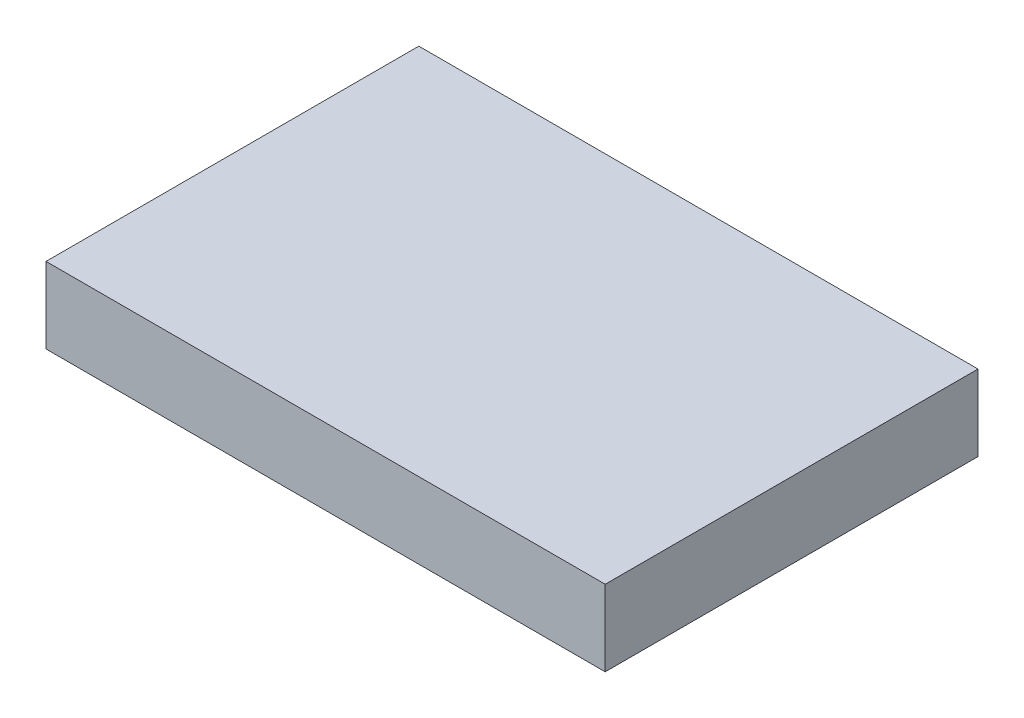
ISO-10303-21;
HEADER;
FILE_DESCRIPTION(('STEP AP214'),'2;1');
FILE_NAME('part.step','',(''),(''),'','','');
FILE_SCHEMA(('AUTOMOTIVE_DESIGN { 1 0 10303 214 1 1 1 1 }'));
ENDSEC;
DATA;
#1=APPLICATION_CONTEXT('core data for automotive mechanical design processes');
#2=APPLICATION_PROTOCOL_DEFINITION('international standard','automotive_design',2000,#1);
#3=PRODUCT_CONTEXT('',#1,'mechanical');
#4=PRODUCT('Part','Part','',(#3));
#5=PRODUCT_RELATED_PRODUCT_CATEGORY('part','',(#4));
#6=PRODUCT_DEFINITION_FORMATION('','',#4);
#7=PRODUCT_DEFINITION_CONTEXT('part definition',#1,'design');
#8=PRODUCT_DEFINITION('design','',#6,#7);
#9=PRODUCT_DEFINITION_SHAPE('','',#8);
#10=(LENGTH_UNIT() NAMED_UNIT(*) SI_UNIT(.MILLI.,.METRE.));
#11=(NAMED_UNIT(*) PLANE_ANGLE_UNIT() SI_UNIT($,.RADIAN.));
#12=(NAMED_UNIT(*) SI_UNIT($,.STERADIAN.) SOLID_ANGLE_UNIT());
#13=UNCERTAINTY_MEASURE_WITH_UNIT(LENGTH_MEASURE(1.E-05),#10,'distance_accuracy_value','');
#14=(GEOMETRIC_REPRESENTATION_CONTEXT(3) GLOBAL_UNCERTAINTY_ASSIGNED_CONTEXT((#13)) GLOBAL_UNIT_ASSIGNED_CONTEXT((#10,
#11,#12)) REPRESENTATION_CONTEXT('',''));
#15=CARTESIAN_POINT('',(0.,0.,0.));
#16=DIRECTION('',(0.,0.,1.));
#17=DIRECTION('',(1.,0.,0.));
#18=AXIS2_PLACEMENT_3D('',#15,#16,#17);
#19=CARTESIAN_POINT('',(0.,10.3378,0.));
#20=DIRECTION('',(1.,0.,0.));
#21=DIRECTION('',(0.,0.,-1.));
#22=AXIS2_PLACEMENT_3D('',#19,#20,#21);
#23=PLANE('',#22);
#24=DIRECTION('',(0.,0.,1.));
#25=VECTOR('',#24,1.);
#26=CARTESIAN_POINT('',(0.,0.,0.));
#27=LINE('',#26,#25);
#28=CARTESIAN_POINT('',(0.,0.,-50.8));
#29=VERTEX_POINT('',#28);
#30=CARTESIAN_POINT('',(0.,0.,0.));
#31=VERTEX_POINT('',#30);
#32=EDGE_CURVE('E111',#29,#31,#27,.T.);
#33=ORIENTED_EDGE('',*,*,#32,.T.);
#34=DIRECTION('',(0.,-1.,0.));
#35=VECTOR('',#34,1.);
#36=CARTESIAN_POINT('',(0.,10.3378,0.));
#37=LINE('',#36,#35);
#38=CARTESIAN_POINT('',(0.,10.3378,0.));
#39=VERTEX_POINT('',#38);
#40=EDGE_CURVE('E11',#39,#31,#37,.T.);
#41=ORIENTED_EDGE('',*,*,#40,.F.);
#42=DIRECTION('',(0.,0.,1.));
#43=VECTOR('',#42,1.);
#44=CARTESIAN_POINT('',(0.,10.3378,0.));
#45=LINE('',#44,#43);
#46=CARTESIAN_POINT('',(0.,10.3378,-50.8));
#47=VERTEX_POINT('',#46);
#48=EDGE_CURVE('E95',#47,#39,#45,.T.);
#49=ORIENTED_EDGE('',*,*,#48,.F.);
#50=DIRECTION('',(0.,-1.,0.));
#51=VECTOR('',#50,1.);
#52=CARTESIAN_POINT('',(0.,10.3378,-50.8));
#53=LINE('',#52,#51);
#54=EDGE_CURVE('E107',#47,#29,#53,.T.);
#55=ORIENTED_EDGE('',*,*,#54,.T.);
#56=EDGE_LOOP('',(#33,#41,#49,#55));
#57=FACE_BOUND('',#56,.T.);
#58=ADVANCED_FACE('F43',(#57),#23,.F.);
#59=CARTESIAN_POINT('',(0.,10.3378,0.));
#60=DIRECTION('',(0.,0.,-1.));
#61=DIRECTION('',(-1.,0.,0.));
#62=AXIS2_PLACEMENT_3D('',#59,#60,#61);
#63=PLANE('',#62);
#64=DIRECTION('',(1.,0.,0.));
#65=VECTOR('',#64,1.);
#66=CARTESIAN_POINT('',(0.,0.,0.));
#67=LINE('',#66,#65);
#68=CARTESIAN_POINT('',(76.2,0.,0.));
#69=VERTEX_POINT('',#68);
#70=EDGE_CURVE('E100',#31,#69,#67,.T.);
#71=ORIENTED_EDGE('',*,*,#70,.T.);
#72=DIRECTION('',(0.,-1.,0.));
#73=VECTOR('',#72,1.);
#74=CARTESIAN_POINT('',(76.2,10.3378,0.));
#75=LINE('',#74,#73);
#76=CARTESIAN_POINT('',(76.2,10.3378,0.));
#77=VERTEX_POINT('',#76);
#78=EDGE_CURVE('E52',#77,#69,#75,.T.);
#79=ORIENTED_EDGE('',*,*,#78,.F.);
#80=DIRECTION('',(1.,0.,0.));
#81=VECTOR('',#80,1.);
#82=CARTESIAN_POINT('',(0.,10.3378,0.));
#83=LINE('',#82,#81);
#84=EDGE_CURVE('E90',#39,#77,#83,.T.);
#85=ORIENTED_EDGE('',*,*,#84,.F.);
#86=ORIENTED_EDGE('',*,*,#40,.T.);
#87=EDGE_LOOP('',(#71,#79,#85,#86));
#88=FACE_BOUND('',#87,.T.);
#89=ADVANCED_FACE('F99',(#88),#63,.F.);
#90=CARTESIAN_POINT('',(76.2,10.3378,0.));
#91=DIRECTION('',(-1.,0.,0.));
#92=DIRECTION('',(0.,0.,1.));
#93=AXIS2_PLACEMENT_3D('',#90,#91,#92);
#94=PLANE('',#93);
#95=DIRECTION('',(0.,0.,-1.));
#96=VECTOR('',#95,1.);
#97=CARTESIAN_POINT('',(76.2,0.,0.));
#98=LINE('',#97,#96);
#99=CARTESIAN_POINT('',(76.2,0.,-50.8));
#100=VERTEX_POINT('',#99);
#101=EDGE_CURVE('E77',#69,#100,#98,.T.);
#102=ORIENTED_EDGE('',*,*,#101,.T.);
#103=DIRECTION('',(0.,-1.,0.));
#104=VECTOR('',#103,1.);
#105=CARTESIAN_POINT('',(76.2,10.3378,-50.8));
#106=LINE('',#105,#104);
#107=CARTESIAN_POINT('',(76.2,10.3378,-50.8));
#108=VERTEX_POINT('',#107);
#109=EDGE_CURVE('E102',#108,#100,#106,.T.);
#110=ORIENTED_EDGE('',*,*,#109,.F.);
#111=DIRECTION('',(0.,0.,-1.));
#112=VECTOR('',#111,1.);
#113=CARTESIAN_POINT('',(76.2,10.3378,0.));
#114=LINE('',#113,#112);
#115=EDGE_CURVE('E93',#77,#108,#114,.T.);
#116=ORIENTED_EDGE('',*,*,#115,.F.);
#117=ORIENTED_EDGE('',*,*,#78,.T.);
#118=EDGE_LOOP('',(#102,#110,#116,#117));
#119=FACE_BOUND('',#118,.T.);
#120=ADVANCED_FACE('F103',(#119),#94,.F.);
#121=CARTESIAN_POINT('',(0.,10.3378,-50.8));
#122=DIRECTION('',(0.,0.,1.));
#123=DIRECTION('',(1.,0.,0.));
#124=AXIS2_PLACEMENT_3D('',#121,#122,#123);
#125=PLANE('',#124);
#126=DIRECTION('',(-1.,0.,0.));
#127=VECTOR('',#126,1.);
#128=CARTESIAN_POINT('',(0.,0.,-50.8));
#129=LINE('',#128,#127);
#130=EDGE_CURVE('E83',#100,#29,#129,.T.);
#131=ORIENTED_EDGE('',*,*,#130,.T.);
#132=ORIENTED_EDGE('',*,*,#54,.F.);
#133=DIRECTION('',(-1.,0.,0.));
#134=VECTOR('',#133,1.);
#135=CARTESIAN_POINT('',(0.,10.3378,-50.8));
#136=LINE('',#135,#134);
#137=EDGE_CURVE('E60',#108,#47,#136,.T.);
#138=ORIENTED_EDGE('',*,*,#137,.F.);
#139=ORIENTED_EDGE('',*,*,#109,.T.);
#140=EDGE_LOOP('',(#131,#132,#138,#139));
#141=FACE_BOUND('',#140,.T.);
#142=ADVANCED_FACE('F124',(#141),#125,.F.);
#143=CARTESIAN_POINT('',(0.,10.3378,0.));
#144=DIRECTION('',(0.,-1.,0.));
#145=DIRECTION('',(0.,0.,-1.));
#146=AXIS2_PLACEMENT_3D('',#143,#144,#145);
#147=PLANE('',#146);
#148=ORIENTED_EDGE('',*,*,#48,.T.);
#149=ORIENTED_EDGE('',*,*,#84,.T.);
#150=ORIENTED_EDGE('',*,*,#115,.T.);
#151=ORIENTED_EDGE('',*,*,#137,.T.);
#152=EDGE_LOOP('',(#148,#149,#150,#151));
#153=FACE_BOUND('',#152,.T.);
#154=ADVANCED_FACE('F91',(#153),#147,.F.);
#155=CARTESIAN_POINT('',(0.,0.,0.));
#156=DIRECTION('',(0.,-1.,0.));
#157=DIRECTION('',(0.,0.,-1.));
#158=AXIS2_PLACEMENT_3D('',#155,#156,#157);
#159=PLANE('',#158);
#160=ORIENTED_EDGE('',*,*,#32,.F.);
#161=ORIENTED_EDGE('',*,*,#130,.F.);
#162=ORIENTED_EDGE('',*,*,#101,.F.);
#163=ORIENTED_EDGE('',*,*,#70,.F.);
#164=EDGE_LOOP('',(#160,#161,#162,#163));
#165=FACE_BOUND('',#164,.T.);
#166=ADVANCED_FACE('F127',(#165),#159,.T.);
#167=CLOSED_SHELL('',(#58,#89,#120,#142,#154,#166));
#168=MANIFOLD_SOLID_BREP('B2',#167);
#169=ADVANCED_BREP_SHAPE_REPRESENTATION('',(#18,#168),#14);
#170=SHAPE_DEFINITION_REPRESENTATION(#9,#169);
ENDSEC;
END-ISO-10303-21;
